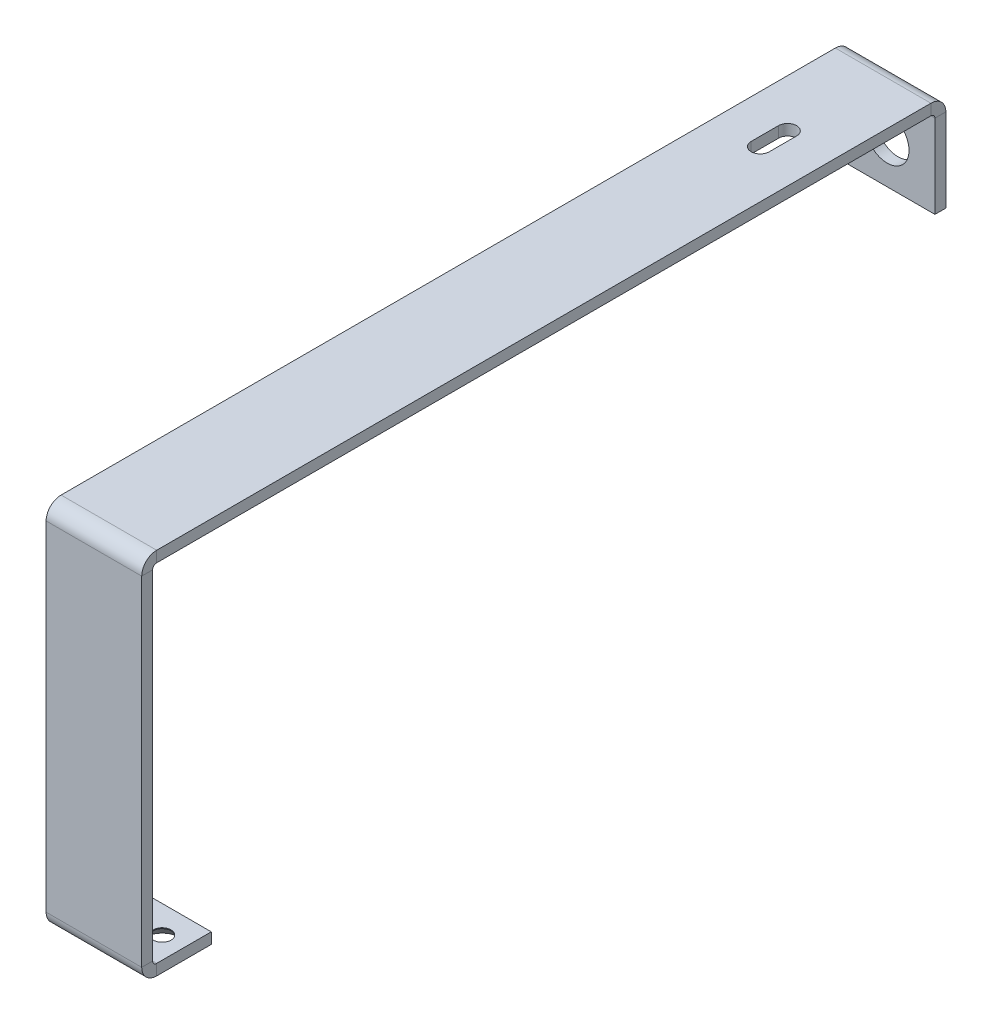
ISO-10303-21;
HEADER;
FILE_DESCRIPTION(('STEP AP214'),'2;1');
FILE_NAME('part.step','',(''),(''),'','','');
FILE_SCHEMA(('AUTOMOTIVE_DESIGN { 1 0 10303 214 1 1 1 1 }'));
ENDSEC;
DATA;
#1=APPLICATION_CONTEXT('core data for automotive mechanical design processes');
#2=APPLICATION_PROTOCOL_DEFINITION('international standard','automotive_design',2000,#1);
#3=PRODUCT_CONTEXT('',#1,'mechanical');
#4=PRODUCT('Part','Part','',(#3));
#5=PRODUCT_RELATED_PRODUCT_CATEGORY('part','',(#4));
#6=PRODUCT_DEFINITION_FORMATION('','',#4);
#7=PRODUCT_DEFINITION_CONTEXT('part definition',#1,'design');
#8=PRODUCT_DEFINITION('design','',#6,#7);
#9=PRODUCT_DEFINITION_SHAPE('','',#8);
#10=(LENGTH_UNIT() NAMED_UNIT(*) SI_UNIT(.MILLI.,.METRE.));
#11=(NAMED_UNIT(*) PLANE_ANGLE_UNIT() SI_UNIT($,.RADIAN.));
#12=(NAMED_UNIT(*) SI_UNIT($,.STERADIAN.) SOLID_ANGLE_UNIT());
#13=UNCERTAINTY_MEASURE_WITH_UNIT(LENGTH_MEASURE(1.E-05),#10,'distance_accuracy_value','');
#14=(GEOMETRIC_REPRESENTATION_CONTEXT(3) GLOBAL_UNCERTAINTY_ASSIGNED_CONTEXT((#13)) GLOBAL_UNIT_ASSIGNED_CONTEXT((#10,
#11,#12)) REPRESENTATION_CONTEXT('',''));
#15=CARTESIAN_POINT('',(0.,0.,0.));
#16=DIRECTION('',(0.,0.,1.));
#17=DIRECTION('',(1.,0.,0.));
#18=AXIS2_PLACEMENT_3D('',#15,#16,#17);
#19=CARTESIAN_POINT('',(0.,2.,0.));
#20=DIRECTION('',(0.,1.,0.));
#21=DIRECTION('',(0.,0.,1.));
#22=AXIS2_PLACEMENT_3D('',#19,#20,#21);
#23=PLANE('',#22);
#24=CARTESIAN_POINT('',(-4.75,2.,0.));
#25=DIRECTION('',(0.,1.,0.));
#26=DIRECTION('',(0.,0.,1.));
#27=AXIS2_PLACEMENT_3D('',#24,#25,#26);
#28=CIRCLE('',#27,1.63195);
#29=CARTESIAN_POINT('',(-4.75,2.,1.63195));
#30=VERTEX_POINT('',#29);
#31=EDGE_CURVE('E276',#30,#30,#28,.F.);
#32=ORIENTED_EDGE('',*,*,#31,.T.);
#33=EDGE_LOOP('',(#32));
#34=FACE_BOUND('',#33,.T.);
#35=DIRECTION('',(0.,0.,-1.));
#36=VECTOR('',#35,1.);
#37=CARTESIAN_POINT('',(8.75,2.,-5.));
#38=LINE('',#37,#36);
#39=CARTESIAN_POINT('',(8.75,2.,5.));
#40=VERTEX_POINT('',#39);
#41=CARTESIAN_POINT('',(8.75,2.,-5.));
#42=VERTEX_POINT('',#41);
#43=EDGE_CURVE('E424',#40,#42,#38,.T.);
#44=ORIENTED_EDGE('',*,*,#43,.T.);
#45=DIRECTION('',(-1.,0.,0.));
#46=VECTOR('',#45,1.);
#47=CARTESIAN_POINT('',(-8.75,2.,-5.));
#48=LINE('',#47,#46);
#49=CARTESIAN_POINT('',(-8.75,2.,-5.));
#50=VERTEX_POINT('',#49);
#51=EDGE_CURVE('E427',#42,#50,#48,.T.);
#52=ORIENTED_EDGE('',*,*,#51,.T.);
#53=DIRECTION('',(0.,0.,1.));
#54=VECTOR('',#53,1.);
#55=CARTESIAN_POINT('',(-8.75,2.,-5.));
#56=LINE('',#55,#54);
#57=CARTESIAN_POINT('',(-8.75,2.,5.));
#58=VERTEX_POINT('',#57);
#59=EDGE_CURVE('E430',#50,#58,#56,.T.);
#60=ORIENTED_EDGE('',*,*,#59,.T.);
#61=DIRECTION('',(1.,0.,0.));
#62=VECTOR('',#61,1.);
#63=CARTESIAN_POINT('',(-8.75,2.,5.));
#64=LINE('',#63,#62);
#65=EDGE_CURVE('E432',#58,#40,#64,.T.);
#66=ORIENTED_EDGE('',*,*,#65,.T.);
#67=EDGE_LOOP('',(#44,#52,#60,#66));
#68=FACE_BOUND('',#67,.T.);
#69=CARTESIAN_POINT('',(4.75,2.,0.));
#70=DIRECTION('',(0.,1.,0.));
#71=DIRECTION('',(0.,0.,1.));
#72=AXIS2_PLACEMENT_3D('',#69,#70,#71);
#73=CIRCLE('',#72,1.63195);
#74=CARTESIAN_POINT('',(4.75,2.,1.63195));
#75=VERTEX_POINT('',#74);
#76=EDGE_CURVE('E285',#75,#75,#73,.F.);
#77=ORIENTED_EDGE('',*,*,#76,.T.);
#78=EDGE_LOOP('',(#77));
#79=FACE_BOUND('',#78,.T.);
#80=ADVANCED_FACE('F103',(#34,#68,#79),#23,.T.);
#81=CARTESIAN_POINT('',(8.74999999999997,67.5000000000005,-139.48688749));
#82=DIRECTION('',(-1.,0.,0.));
#83=DIRECTION('',(0.,0.,1.));
#84=AXIS2_PLACEMENT_3D('',#81,#82,#83);
#85=PLANE('',#84);
#86=DIRECTION('',(0.,1.,0.));
#87=VECTOR('',#86,1.);
#88=CARTESIAN_POINT('',(8.74999999999999,65.5000000000005,-136.75028749));
#89=LINE('',#88,#87);
#90=CARTESIAN_POINT('',(8.74999999999997,65.5000000000005,-136.75028749));
#91=VERTEX_POINT('',#90);
#92=CARTESIAN_POINT('',(8.74999999999999,67.5000000000005,-136.75028749));
#93=VERTEX_POINT('',#92);
#94=EDGE_CURVE('E332',#91,#93,#89,.T.);
#95=ORIENTED_EDGE('',*,*,#94,.T.);
#96=DIRECTION('',(0.,0.,-1.));
#97=VECTOR('',#96,1.);
#98=CARTESIAN_POINT('',(8.74999999999999,67.5,2.4449831581799E-13));
#99=LINE('',#98,#97);
#100=CARTESIAN_POINT('',(8.74999999999998,67.5,5.));
#101=VERTEX_POINT('',#100);
#102=EDGE_CURVE('E352',#101,#93,#99,.T.);
#103=ORIENTED_EDGE('',*,*,#102,.F.);
#104=DIRECTION('',(0.,-1.,0.));
#105=VECTOR('',#104,1.);
#106=CARTESIAN_POINT('',(8.74999999999998,65.5,4.99999999999999));
#107=LINE('',#106,#105);
#108=CARTESIAN_POINT('',(8.74999999999998,65.5,4.99999999999999));
#109=VERTEX_POINT('',#108);
#110=EDGE_CURVE('E362',#109,#101,#107,.F.);
#111=ORIENTED_EDGE('',*,*,#110,.F.);
#112=DIRECTION('',(0.,0.,1.));
#113=VECTOR('',#112,1.);
#114=CARTESIAN_POINT('',(8.74999999999997,65.5000000000005,-139.48688749));
#115=LINE('',#114,#113);
#116=EDGE_CURVE('E356',#109,#91,#115,.F.);
#117=ORIENTED_EDGE('',*,*,#116,.T.);
#118=EDGE_LOOP('',(#95,#103,#111,#117));
#119=FACE_BOUND('',#118,.T.);
#120=ADVANCED_FACE('F491',(#119),#85,.F.);
#121=CARTESIAN_POINT('',(-8.75000000000002,67.5,5.7366));
#122=DIRECTION('',(1.,0.,0.));
#123=DIRECTION('',(0.,0.,-1.));
#124=AXIS2_PLACEMENT_3D('',#121,#122,#123);
#125=PLANE('',#124);
#126=DIRECTION('',(0.,1.,0.));
#127=VECTOR('',#126,1.);
#128=CARTESIAN_POINT('',(-8.75,65.5000000000005,-136.75028749));
#129=LINE('',#128,#127);
#130=CARTESIAN_POINT('',(-8.75,65.5000000000005,-136.75028749));
#131=VERTEX_POINT('',#130);
#132=CARTESIAN_POINT('',(-8.75,67.5000000000005,-136.75028749));
#133=VERTEX_POINT('',#132);
#134=EDGE_CURVE('E343',#131,#133,#129,.T.);
#135=ORIENTED_EDGE('',*,*,#134,.F.);
#136=DIRECTION('',(0.,0.,-1.));
#137=VECTOR('',#136,1.);
#138=CARTESIAN_POINT('',(-8.75000000000002,65.5,5.7366));
#139=LINE('',#138,#137);
#140=CARTESIAN_POINT('',(-8.75000000000002,65.5,4.99999999999999));
#141=VERTEX_POINT('',#140);
#142=EDGE_CURVE('E354',#131,#141,#139,.F.);
#143=ORIENTED_EDGE('',*,*,#142,.T.);
#144=DIRECTION('',(0.,-1.,0.));
#145=VECTOR('',#144,1.);
#146=CARTESIAN_POINT('',(-8.75000000000002,67.5,5.));
#147=LINE('',#146,#145);
#148=CARTESIAN_POINT('',(-8.75000000000002,67.5,5.));
#149=VERTEX_POINT('',#148);
#150=EDGE_CURVE('E346',#141,#149,#147,.F.);
#151=ORIENTED_EDGE('',*,*,#150,.T.);
#152=DIRECTION('',(0.,0.,1.));
#153=VECTOR('',#152,1.);
#154=CARTESIAN_POINT('',(-8.75000000000002,67.5,2.45648041233958E-13));
#155=LINE('',#154,#153);
#156=EDGE_CURVE('E349',#133,#149,#155,.T.);
#157=ORIENTED_EDGE('',*,*,#156,.F.);
#158=EDGE_LOOP('',(#135,#143,#151,#157));
#159=FACE_BOUND('',#158,.T.);
#160=ADVANCED_FACE('F546',(#159),#125,.F.);
#161=CARTESIAN_POINT('',(0.,67.5,2.45648041233958E-13));
#162=DIRECTION('',(0.,-1.,0.));
#163=DIRECTION('',(0.,0.,-1.));
#164=AXIS2_PLACEMENT_3D('',#161,#162,#163);
#165=PLANE('',#164);
#166=DIRECTION('',(0.,0.,1.));
#167=VECTOR('',#166,1.);
#168=CARTESIAN_POINT('',(-1.65,67.5000000000004,-119.25028749));
#169=LINE('',#168,#167);
#170=CARTESIAN_POINT('',(-1.65,67.5000000000004,-119.25028749));
#171=VERTEX_POINT('',#170);
#172=CARTESIAN_POINT('',(-1.65,67.5000000000004,-114.25028749));
#173=VERTEX_POINT('',#172);
#174=EDGE_CURVE('E842',#171,#173,#169,.T.);
#175=ORIENTED_EDGE('',*,*,#174,.F.);
#176=CARTESIAN_POINT('',(0.,67.5000000000004,-119.25028749));
#177=DIRECTION('',(0.,-1.,0.));
#178=DIRECTION('',(0.,0.,-1.));
#179=AXIS2_PLACEMENT_3D('',#176,#177,#178);
#180=CIRCLE('',#179,1.65);
#181=CARTESIAN_POINT('',(1.65,67.5000000000004,-119.25028749));
#182=VERTEX_POINT('',#181);
#183=EDGE_CURVE('E271',#182,#171,#180,.F.);
#184=ORIENTED_EDGE('',*,*,#183,.F.);
#185=DIRECTION('',(0.,0.,-1.));
#186=VECTOR('',#185,1.);
#187=CARTESIAN_POINT('',(1.65,67.5000000000004,-119.25028749));
#188=LINE('',#187,#186);
#189=CARTESIAN_POINT('',(1.65,67.5000000000004,-114.25028749));
#190=VERTEX_POINT('',#189);
#191=EDGE_CURVE('E268',#190,#182,#188,.T.);
#192=ORIENTED_EDGE('',*,*,#191,.F.);
#193=CARTESIAN_POINT('',(0.,67.5000000000004,-114.25028749));
#194=DIRECTION('',(0.,-1.,0.));
#195=DIRECTION('',(0.,0.,-1.));
#196=AXIS2_PLACEMENT_3D('',#193,#194,#195);
#197=CIRCLE('',#196,1.65);
#198=EDGE_CURVE('E246',#173,#190,#197,.F.);
#199=ORIENTED_EDGE('',*,*,#198,.F.);
#200=EDGE_LOOP('',(#175,#184,#192,#199));
#201=FACE_BOUND('',#200,.T.);
#202=DIRECTION('',(1.,0.,0.));
#203=VECTOR('',#202,1.);
#204=CARTESIAN_POINT('',(8.75,67.5000000000005,-136.75028749));
#205=LINE('',#204,#203);
#206=EDGE_CURVE('E326',#93,#133,#205,.F.);
#207=ORIENTED_EDGE('',*,*,#206,.T.);
#208=ORIENTED_EDGE('',*,*,#156,.T.);
#209=DIRECTION('',(1.,0.,0.));
#210=VECTOR('',#209,1.);
#211=CARTESIAN_POINT('',(-8.75000000000002,67.5,5.));
#212=LINE('',#211,#210);
#213=EDGE_CURVE('E359',#101,#149,#212,.F.);
#214=ORIENTED_EDGE('',*,*,#213,.F.);
#215=ORIENTED_EDGE('',*,*,#102,.T.);
#216=EDGE_LOOP('',(#207,#208,#214,#215));
#217=FACE_BOUND('',#216,.T.);
#218=ADVANCED_FACE('F489',(#201,#217),#165,.F.);
#219=CARTESIAN_POINT('',(0.,65.5,2.38665078556272E-13));
#220=DIRECTION('',(0.,-1.,0.));
#221=DIRECTION('',(0.,0.,-1.));
#222=AXIS2_PLACEMENT_3D('',#219,#220,#221);
#223=PLANE('',#222);
#224=CARTESIAN_POINT('',(0.,65.5000000000004,-119.25028749));
#225=DIRECTION('',(0.,-1.,0.));
#226=DIRECTION('',(0.,0.,-1.));
#227=AXIS2_PLACEMENT_3D('',#224,#225,#226);
#228=CIRCLE('',#227,1.65);
#229=CARTESIAN_POINT('',(-1.65,65.5000000000004,-119.25028749));
#230=VERTEX_POINT('',#229);
#231=CARTESIAN_POINT('',(1.65,65.5000000000004,-119.25028749));
#232=VERTEX_POINT('',#231);
#233=EDGE_CURVE('E126',#230,#232,#228,.T.);
#234=ORIENTED_EDGE('',*,*,#233,.F.);
#235=DIRECTION('',(0.,0.,-1.));
#236=VECTOR('',#235,1.);
#237=CARTESIAN_POINT('',(-1.65,65.5000000000004,-119.25028749));
#238=LINE('',#237,#236);
#239=CARTESIAN_POINT('',(-1.65,65.5000000000004,-114.25028749));
#240=VERTEX_POINT('',#239);
#241=EDGE_CURVE('E259',#240,#230,#238,.T.);
#242=ORIENTED_EDGE('',*,*,#241,.F.);
#243=CARTESIAN_POINT('',(0.,65.5000000000004,-114.25028749));
#244=DIRECTION('',(0.,-1.,0.));
#245=DIRECTION('',(0.,0.,-1.));
#246=AXIS2_PLACEMENT_3D('',#243,#244,#245);
#247=CIRCLE('',#246,1.65);
#248=CARTESIAN_POINT('',(1.65,65.5000000000004,-114.25028749));
#249=VERTEX_POINT('',#248);
#250=EDGE_CURVE('E243',#249,#240,#247,.T.);
#251=ORIENTED_EDGE('',*,*,#250,.F.);
#252=DIRECTION('',(0.,0.,1.));
#253=VECTOR('',#252,1.);
#254=CARTESIAN_POINT('',(1.65,65.5000000000004,-119.25028749));
#255=LINE('',#254,#253);
#256=EDGE_CURVE('E252',#232,#249,#255,.T.);
#257=ORIENTED_EDGE('',*,*,#256,.F.);
#258=EDGE_LOOP('',(#234,#242,#251,#257));
#259=FACE_BOUND('',#258,.T.);
#260=ORIENTED_EDGE('',*,*,#142,.F.);
#261=DIRECTION('',(1.,0.,0.));
#262=VECTOR('',#261,1.);
#263=CARTESIAN_POINT('',(8.75,65.5000000000005,-136.75028749));
#264=LINE('',#263,#262);
#265=EDGE_CURVE('E338',#91,#131,#264,.F.);
#266=ORIENTED_EDGE('',*,*,#265,.F.);
#267=ORIENTED_EDGE('',*,*,#116,.F.);
#268=DIRECTION('',(1.,0.,0.));
#269=VECTOR('',#268,1.);
#270=CARTESIAN_POINT('',(-8.75000000000002,65.5,4.99999999999999));
#271=LINE('',#270,#269);
#272=EDGE_CURVE('E365',#141,#109,#271,.T.);
#273=ORIENTED_EDGE('',*,*,#272,.F.);
#274=EDGE_LOOP('',(#260,#266,#267,#273));
#275=FACE_BOUND('',#274,.T.);
#276=ADVANCED_FACE('F256',(#259,#275),#223,.T.);
#277=CARTESIAN_POINT('',(8.74999999999999,67.5,7.7366));
#278=DIRECTION('',(-1.,0.,0.));
#279=DIRECTION('',(0.,-1.,0.));
#280=AXIS2_PLACEMENT_3D('',#277,#278,#279);
#281=PLANE('',#280);
#282=DIRECTION('',(0.,0.,1.));
#283=VECTOR('',#282,1.);
#284=CARTESIAN_POINT('',(8.74999999999998,64.7634,5.73659999999999));
#285=LINE('',#284,#283);
#286=CARTESIAN_POINT('',(8.74999999999999,64.7634,5.7366));
#287=VERTEX_POINT('',#286);
#288=CARTESIAN_POINT('',(8.74999999999998,64.7634,7.73659999999999));
#289=VERTEX_POINT('',#288);
#290=EDGE_CURVE('E375',#287,#289,#285,.T.);
#291=ORIENTED_EDGE('',*,*,#290,.T.);
#292=DIRECTION('',(0.,1.,0.));
#293=VECTOR('',#292,1.);
#294=CARTESIAN_POINT('',(8.74999999999999,0.,7.7366));
#295=LINE('',#294,#293);
#296=CARTESIAN_POINT('',(8.74999999999999,2.7366,7.7366));
#297=VERTEX_POINT('',#296);
#298=EDGE_CURVE('E395',#297,#289,#295,.T.);
#299=ORIENTED_EDGE('',*,*,#298,.F.);
#300=DIRECTION('',(0.,0.,-1.));
#301=VECTOR('',#300,1.);
#302=CARTESIAN_POINT('',(8.74999999999999,2.7366,5.7366));
#303=LINE('',#302,#301);
#304=CARTESIAN_POINT('',(8.74999999999999,2.7366,5.7366));
#305=VERTEX_POINT('',#304);
#306=EDGE_CURVE('E405',#305,#297,#303,.F.);
#307=ORIENTED_EDGE('',*,*,#306,.F.);
#308=DIRECTION('',(0.,-1.,0.));
#309=VECTOR('',#308,1.);
#310=CARTESIAN_POINT('',(8.74999999999999,67.5,5.7366));
#311=LINE('',#310,#309);
#312=EDGE_CURVE('E399',#305,#287,#311,.F.);
#313=ORIENTED_EDGE('',*,*,#312,.T.);
#314=EDGE_LOOP('',(#291,#299,#307,#313));
#315=FACE_BOUND('',#314,.T.);
#316=ADVANCED_FACE('F473',(#315),#281,.F.);
#317=CARTESIAN_POINT('',(-8.74999999999999,2.,7.7366));
#318=DIRECTION('',(1.,0.,0.));
#319=DIRECTION('',(0.,1.,0.));
#320=AXIS2_PLACEMENT_3D('',#317,#318,#319);
#321=PLANE('',#320);
#322=DIRECTION('',(0.,0.,1.));
#323=VECTOR('',#322,1.);
#324=CARTESIAN_POINT('',(-8.75000000000002,64.7634,5.73659999999999));
#325=LINE('',#324,#323);
#326=CARTESIAN_POINT('',(-8.75000000000002,64.7634,5.73659999999999));
#327=VERTEX_POINT('',#326);
#328=CARTESIAN_POINT('',(-8.75000000000002,64.7634,7.7366));
#329=VERTEX_POINT('',#328);
#330=EDGE_CURVE('E386',#327,#329,#325,.T.);
#331=ORIENTED_EDGE('',*,*,#330,.F.);
#332=DIRECTION('',(0.,1.,0.));
#333=VECTOR('',#332,1.);
#334=CARTESIAN_POINT('',(-8.74999999999999,2.,5.7366));
#335=LINE('',#334,#333);
#336=CARTESIAN_POINT('',(-8.74999999999998,2.7366,5.7366));
#337=VERTEX_POINT('',#336);
#338=EDGE_CURVE('E397',#327,#337,#335,.F.);
#339=ORIENTED_EDGE('',*,*,#338,.T.);
#340=DIRECTION('',(0.,0.,-1.));
#341=VECTOR('',#340,1.);
#342=CARTESIAN_POINT('',(-8.74999999999999,2.7366,7.7366));
#343=LINE('',#342,#341);
#344=CARTESIAN_POINT('',(-8.74999999999998,2.7366,7.7366));
#345=VERTEX_POINT('',#344);
#346=EDGE_CURVE('E389',#337,#345,#343,.F.);
#347=ORIENTED_EDGE('',*,*,#346,.T.);
#348=DIRECTION('',(0.,-1.,0.));
#349=VECTOR('',#348,1.);
#350=CARTESIAN_POINT('',(-8.74999999999999,0.,7.7366));
#351=LINE('',#350,#349);
#352=EDGE_CURVE('E392',#329,#345,#351,.T.);
#353=ORIENTED_EDGE('',*,*,#352,.F.);
#354=EDGE_LOOP('',(#331,#339,#347,#353));
#355=FACE_BOUND('',#354,.T.);
#356=ADVANCED_FACE('F589',(#355),#321,.F.);
#357=CARTESIAN_POINT('',(0.,0.,7.7366));
#358=DIRECTION('',(0.,0.,-1.));
#359=DIRECTION('',(-1.,0.,0.));
#360=AXIS2_PLACEMENT_3D('',#357,#358,#359);
#361=PLANE('',#360);
#362=DIRECTION('',(1.,0.,0.));
#363=VECTOR('',#362,1.);
#364=CARTESIAN_POINT('',(8.74999999999999,64.7634,7.73659999999999));
#365=LINE('',#364,#363);
#366=EDGE_CURVE('E369',#289,#329,#365,.F.);
#367=ORIENTED_EDGE('',*,*,#366,.T.);
#368=ORIENTED_EDGE('',*,*,#352,.T.);
#369=DIRECTION('',(1.,0.,0.));
#370=VECTOR('',#369,1.);
#371=CARTESIAN_POINT('',(-8.75,2.7366,7.7366));
#372=LINE('',#371,#370);
#373=EDGE_CURVE('E402',#297,#345,#372,.F.);
#374=ORIENTED_EDGE('',*,*,#373,.F.);
#375=ORIENTED_EDGE('',*,*,#298,.T.);
#376=EDGE_LOOP('',(#367,#368,#374,#375));
#377=FACE_BOUND('',#376,.T.);
#378=ADVANCED_FACE('F469',(#377),#361,.F.);
#379=CARTESIAN_POINT('',(0.,0.,5.7366));
#380=DIRECTION('',(0.,0.,-1.));
#381=DIRECTION('',(-1.,0.,0.));
#382=AXIS2_PLACEMENT_3D('',#379,#380,#381);
#383=PLANE('',#382);
#384=ORIENTED_EDGE('',*,*,#338,.F.);
#385=DIRECTION('',(1.,0.,0.));
#386=VECTOR('',#385,1.);
#387=CARTESIAN_POINT('',(8.74999999999999,64.7634,5.73659999999999));
#388=LINE('',#387,#386);
#389=EDGE_CURVE('E381',#287,#327,#388,.F.);
#390=ORIENTED_EDGE('',*,*,#389,.F.);
#391=ORIENTED_EDGE('',*,*,#312,.F.);
#392=DIRECTION('',(1.,0.,0.));
#393=VECTOR('',#392,1.);
#394=CARTESIAN_POINT('',(-8.75,2.7366,5.7366));
#395=LINE('',#394,#393);
#396=EDGE_CURVE('E408',#337,#305,#395,.T.);
#397=ORIENTED_EDGE('',*,*,#396,.F.);
#398=EDGE_LOOP('',(#384,#390,#391,#397));
#399=FACE_BOUND('',#398,.T.);
#400=ADVANCED_FACE('F561',(#399),#383,.T.);
#401=CARTESIAN_POINT('',(8.75,2.,-5.));
#402=DIRECTION('',(-1.,0.,0.));
#403=DIRECTION('',(0.,0.,1.));
#404=AXIS2_PLACEMENT_3D('',#401,#402,#403);
#405=PLANE('',#404);
#406=DIRECTION('',(0.,0.,-1.));
#407=VECTOR('',#406,1.);
#408=CARTESIAN_POINT('',(8.75,0.,-5.));
#409=LINE('',#408,#407);
#410=CARTESIAN_POINT('',(8.74999999999999,0.,5.));
#411=VERTEX_POINT('',#410);
#412=CARTESIAN_POINT('',(8.75,0.,-5.));
#413=VERTEX_POINT('',#412);
#414=EDGE_CURVE('E415',#411,#413,#409,.T.);
#415=ORIENTED_EDGE('',*,*,#414,.T.);
#416=DIRECTION('',(0.,-1.,0.));
#417=VECTOR('',#416,1.);
#418=CARTESIAN_POINT('',(8.75,2.,-5.));
#419=LINE('',#418,#417);
#420=EDGE_CURVE('E13',#42,#413,#419,.T.);
#421=ORIENTED_EDGE('',*,*,#420,.F.);
#422=ORIENTED_EDGE('',*,*,#43,.F.);
#423=DIRECTION('',(0.,-1.,0.));
#424=VECTOR('',#423,1.);
#425=CARTESIAN_POINT('',(8.75,2.,5.));
#426=LINE('',#425,#424);
#427=EDGE_CURVE('E434',#40,#411,#426,.T.);
#428=ORIENTED_EDGE('',*,*,#427,.T.);
#429=EDGE_LOOP('',(#415,#421,#422,#428));
#430=FACE_BOUND('',#429,.T.);
#431=ADVANCED_FACE('F105',(#430),#405,.F.);
#432=CARTESIAN_POINT('',(-8.75,2.,-5.));
#433=DIRECTION('',(0.,0.,1.));
#434=DIRECTION('',(1.,0.,0.));
#435=AXIS2_PLACEMENT_3D('',#432,#433,#434);
#436=PLANE('',#435);
#437=DIRECTION('',(-1.,0.,0.));
#438=VECTOR('',#437,1.);
#439=CARTESIAN_POINT('',(-8.75,0.,-5.));
#440=LINE('',#439,#438);
#441=CARTESIAN_POINT('',(-8.75,0.,-5.));
#442=VERTEX_POINT('',#441);
#443=EDGE_CURVE('E437',#413,#442,#440,.T.);
#444=ORIENTED_EDGE('',*,*,#443,.T.);
#445=DIRECTION('',(0.,-1.,0.));
#446=VECTOR('',#445,1.);
#447=CARTESIAN_POINT('',(-8.75,2.,-5.));
#448=LINE('',#447,#446);
#449=EDGE_CURVE('E111',#50,#442,#448,.T.);
#450=ORIENTED_EDGE('',*,*,#449,.F.);
#451=ORIENTED_EDGE('',*,*,#51,.F.);
#452=ORIENTED_EDGE('',*,*,#420,.T.);
#453=EDGE_LOOP('',(#444,#450,#451,#452));
#454=FACE_BOUND('',#453,.T.);
#455=ADVANCED_FACE('F556',(#454),#436,.F.);
#456=CARTESIAN_POINT('',(-8.75,2.,-5.));
#457=DIRECTION('',(1.,0.,0.));
#458=DIRECTION('',(0.,0.,-1.));
#459=AXIS2_PLACEMENT_3D('',#456,#457,#458);
#460=PLANE('',#459);
#461=DIRECTION('',(0.,0.,1.));
#462=VECTOR('',#461,1.);
#463=CARTESIAN_POINT('',(-8.75,0.,-5.));
#464=LINE('',#463,#462);
#465=CARTESIAN_POINT('',(-8.75,0.,5.));
#466=VERTEX_POINT('',#465);
#467=EDGE_CURVE('E439',#442,#466,#464,.T.);
#468=ORIENTED_EDGE('',*,*,#467,.T.);
#469=DIRECTION('',(0.,-1.,0.));
#470=VECTOR('',#469,1.);
#471=CARTESIAN_POINT('',(-8.75,2.,5.));
#472=LINE('',#471,#470);
#473=EDGE_CURVE('E445',#58,#466,#472,.T.);
#474=ORIENTED_EDGE('',*,*,#473,.F.);
#475=ORIENTED_EDGE('',*,*,#59,.F.);
#476=ORIENTED_EDGE('',*,*,#449,.T.);
#477=EDGE_LOOP('',(#468,#474,#475,#476));
#478=FACE_BOUND('',#477,.T.);
#479=ADVANCED_FACE('F452',(#478),#460,.F.);
#480=CARTESIAN_POINT('',(0.,0.,0.));
#481=DIRECTION('',(0.,1.,0.));
#482=DIRECTION('',(0.,0.,1.));
#483=AXIS2_PLACEMENT_3D('',#480,#481,#482);
#484=PLANE('',#483);
#485=CARTESIAN_POINT('',(-4.75,0.,0.));
#486=DIRECTION('',(0.,-1.,0.));
#487=DIRECTION('',(0.,0.,-1.));
#488=AXIS2_PLACEMENT_3D('',#485,#486,#487);
#489=CIRCLE('',#488,3.2385);
#490=CARTESIAN_POINT('',(-4.75,0.,-3.2385));
#491=VERTEX_POINT('',#490);
#492=EDGE_CURVE('E270',#491,#491,#489,.T.);
#493=ORIENTED_EDGE('',*,*,#492,.F.);
#494=EDGE_LOOP('',(#493));
#495=FACE_BOUND('',#494,.T.);
#496=CARTESIAN_POINT('',(4.75,0.,0.));
#497=DIRECTION('',(0.,-1.,0.));
#498=DIRECTION('',(0.,0.,-1.));
#499=AXIS2_PLACEMENT_3D('',#496,#497,#498);
#500=CIRCLE('',#499,3.2385);
#501=CARTESIAN_POINT('',(4.75,0.,-3.2385));
#502=VERTEX_POINT('',#501);
#503=EDGE_CURVE('E275',#502,#502,#500,.T.);
#504=ORIENTED_EDGE('',*,*,#503,.F.);
#505=EDGE_LOOP('',(#504));
#506=FACE_BOUND('',#505,.T.);
#507=ORIENTED_EDGE('',*,*,#414,.F.);
#508=DIRECTION('',(1.,0.,0.));
#509=VECTOR('',#508,1.);
#510=CARTESIAN_POINT('',(-8.75,0.,5.));
#511=LINE('',#510,#509);
#512=EDGE_CURVE('E428',#466,#411,#511,.T.);
#513=ORIENTED_EDGE('',*,*,#512,.F.);
#514=ORIENTED_EDGE('',*,*,#467,.F.);
#515=ORIENTED_EDGE('',*,*,#443,.F.);
#516=EDGE_LOOP('',(#507,#513,#514,#515));
#517=FACE_BOUND('',#516,.T.);
#518=ADVANCED_FACE('F457',(#495,#506,#517),#484,.F.);
#519=CARTESIAN_POINT('',(-8.74999999999999,2.7366,5.));
#520=DIRECTION('',(-1.,0.,0.));
#521=DIRECTION('',(0.,0.,1.));
#522=AXIS2_PLACEMENT_3D('',#519,#520,#521);
#523=PLANE('',#522);
#524=ORIENTED_EDGE('',*,*,#346,.F.);
#525=CARTESIAN_POINT('',(-8.74999999999999,2.7366,5.));
#526=DIRECTION('',(1.,0.,0.));
#527=DIRECTION('',(0.,0.,-1.));
#528=AXIS2_PLACEMENT_3D('',#525,#526,#527);
#529=CIRCLE('',#528,0.736599999999998);
#530=EDGE_CURVE('E419',#58,#337,#529,.F.);
#531=ORIENTED_EDGE('',*,*,#530,.F.);
#532=ORIENTED_EDGE('',*,*,#473,.T.);
#533=CARTESIAN_POINT('',(-8.74999999999998,2.7366,5.));
#534=DIRECTION('',(1.,0.,0.));
#535=DIRECTION('',(0.,0.,-1.));
#536=AXIS2_PLACEMENT_3D('',#533,#534,#535);
#537=CIRCLE('',#536,2.7366);
#538=EDGE_CURVE('E412',#466,#345,#537,.F.);
#539=ORIENTED_EDGE('',*,*,#538,.T.);
#540=EDGE_LOOP('',(#524,#531,#532,#539));
#541=FACE_BOUND('',#540,.T.);
#542=ADVANCED_FACE('F463',(#541),#523,.T.);
#543=CARTESIAN_POINT('',(8.74999999999999,2.7366,5.));
#544=DIRECTION('',(-1.,0.,0.));
#545=DIRECTION('',(0.,0.,1.));
#546=AXIS2_PLACEMENT_3D('',#543,#544,#545);
#547=PLANE('',#546);
#548=CARTESIAN_POINT('',(8.74999999999999,2.7366,5.));
#549=DIRECTION('',(1.,0.,0.));
#550=DIRECTION('',(0.,0.,-1.));
#551=AXIS2_PLACEMENT_3D('',#548,#549,#550);
#552=CIRCLE('',#551,0.736599999999998);
#553=EDGE_CURVE('E394',#305,#40,#552,.T.);
#554=ORIENTED_EDGE('',*,*,#553,.F.);
#555=ORIENTED_EDGE('',*,*,#306,.T.);
#556=CARTESIAN_POINT('',(8.74999999999999,2.7366,5.));
#557=DIRECTION('',(1.,0.,0.));
#558=DIRECTION('',(0.,0.,-1.));
#559=AXIS2_PLACEMENT_3D('',#556,#557,#558);
#560=CIRCLE('',#559,2.7366);
#561=EDGE_CURVE('E416',#297,#411,#560,.T.);
#562=ORIENTED_EDGE('',*,*,#561,.T.);
#563=ORIENTED_EDGE('',*,*,#427,.F.);
#564=EDGE_LOOP('',(#554,#555,#562,#563));
#565=FACE_BOUND('',#564,.T.);
#566=ADVANCED_FACE('F551',(#565),#547,.F.);
#567=CARTESIAN_POINT('',(8.74999999999999,2.7366,5.));
#568=DIRECTION('',(1.,0.,0.));
#569=DIRECTION('',(0.,0.,1.));
#570=AXIS2_PLACEMENT_3D('',#567,#568,#569);
#571=CYLINDRICAL_SURFACE('',#570,2.7366);
#572=ORIENTED_EDGE('',*,*,#512,.T.);
#573=ORIENTED_EDGE('',*,*,#561,.F.);
#574=ORIENTED_EDGE('',*,*,#373,.T.);
#575=ORIENTED_EDGE('',*,*,#538,.F.);
#576=EDGE_LOOP('',(#572,#573,#574,#575));
#577=FACE_BOUND('',#576,.T.);
#578=ADVANCED_FACE('F465',(#577),#571,.T.);
#579=CARTESIAN_POINT('',(8.74999999999999,2.7366,5.));
#580=DIRECTION('',(1.,0.,0.));
#581=DIRECTION('',(0.,0.,1.));
#582=AXIS2_PLACEMENT_3D('',#579,#580,#581);
#583=CYLINDRICAL_SURFACE('',#582,0.736599999999998);
#584=ORIENTED_EDGE('',*,*,#65,.F.);
#585=ORIENTED_EDGE('',*,*,#530,.T.);
#586=ORIENTED_EDGE('',*,*,#396,.T.);
#587=ORIENTED_EDGE('',*,*,#553,.T.);
#588=EDGE_LOOP('',(#584,#585,#586,#587));
#589=FACE_BOUND('',#588,.T.);
#590=ADVANCED_FACE('F569',(#589),#583,.F.);
#591=CARTESIAN_POINT('',(-8.75000000000002,64.7634,4.99999999999999));
#592=DIRECTION('',(-1.,0.,0.));
#593=DIRECTION('',(0.,0.,1.));
#594=AXIS2_PLACEMENT_3D('',#591,#592,#593);
#595=PLANE('',#594);
#596=ORIENTED_EDGE('',*,*,#150,.F.);
#597=CARTESIAN_POINT('',(-8.75000000000002,64.7634,4.99999999999999));
#598=DIRECTION('',(1.,0.,0.));
#599=DIRECTION('',(0.,0.,-1.));
#600=AXIS2_PLACEMENT_3D('',#597,#598,#599);
#601=CIRCLE('',#600,0.736600000000004);
#602=EDGE_CURVE('E378',#327,#141,#601,.F.);
#603=ORIENTED_EDGE('',*,*,#602,.F.);
#604=ORIENTED_EDGE('',*,*,#330,.T.);
#605=CARTESIAN_POINT('',(-8.75000000000002,64.7634,4.99999999999999));
#606=DIRECTION('',(1.,0.,0.));
#607=DIRECTION('',(0.,0.,-1.));
#608=AXIS2_PLACEMENT_3D('',#605,#606,#607);
#609=CIRCLE('',#608,2.7366);
#610=EDGE_CURVE('E371',#329,#149,#609,.F.);
#611=ORIENTED_EDGE('',*,*,#610,.T.);
#612=EDGE_LOOP('',(#596,#603,#604,#611));
#613=FACE_BOUND('',#612,.T.);
#614=ADVANCED_FACE('F579',(#613),#595,.T.);
#615=CARTESIAN_POINT('',(8.74999999999998,64.7634,4.99999999999999));
#616=DIRECTION('',(-1.,0.,0.));
#617=DIRECTION('',(0.,0.,1.));
#618=AXIS2_PLACEMENT_3D('',#615,#616,#617);
#619=PLANE('',#618);
#620=CARTESIAN_POINT('',(8.74999999999998,64.7634,4.99999999999999));
#621=DIRECTION('',(1.,0.,0.));
#622=DIRECTION('',(0.,0.,-1.));
#623=AXIS2_PLACEMENT_3D('',#620,#621,#622);
#624=CIRCLE('',#623,0.736600000000004);
#625=EDGE_CURVE('E351',#109,#287,#624,.T.);
#626=ORIENTED_EDGE('',*,*,#625,.F.);
#627=ORIENTED_EDGE('',*,*,#110,.T.);
#628=CARTESIAN_POINT('',(8.74999999999998,64.7634,4.99999999999999));
#629=DIRECTION('',(1.,0.,0.));
#630=DIRECTION('',(0.,0.,-1.));
#631=AXIS2_PLACEMENT_3D('',#628,#629,#630);
#632=CIRCLE('',#631,2.7366);
#633=EDGE_CURVE('E372',#101,#289,#632,.T.);
#634=ORIENTED_EDGE('',*,*,#633,.T.);
#635=ORIENTED_EDGE('',*,*,#290,.F.);
#636=EDGE_LOOP('',(#626,#627,#634,#635));
#637=FACE_BOUND('',#636,.T.);
#638=ADVANCED_FACE('F482',(#637),#619,.F.);
#639=CARTESIAN_POINT('',(8.74999999999999,64.7634,4.99999999999999));
#640=DIRECTION('',(1.,0.,0.));
#641=DIRECTION('',(0.,1.,0.));
#642=AXIS2_PLACEMENT_3D('',#639,#640,#641);
#643=CYLINDRICAL_SURFACE('',#642,2.7366);
#644=ORIENTED_EDGE('',*,*,#366,.F.);
#645=ORIENTED_EDGE('',*,*,#633,.F.);
#646=ORIENTED_EDGE('',*,*,#213,.T.);
#647=ORIENTED_EDGE('',*,*,#610,.F.);
#648=EDGE_LOOP('',(#644,#645,#646,#647));
#649=FACE_BOUND('',#648,.T.);
#650=ADVANCED_FACE('F481',(#649),#643,.T.);
#651=CARTESIAN_POINT('',(8.74999999999999,64.7634,4.99999999999999));
#652=DIRECTION('',(1.,0.,0.));
#653=DIRECTION('',(0.,1.,0.));
#654=AXIS2_PLACEMENT_3D('',#651,#652,#653);
#655=CYLINDRICAL_SURFACE('',#654,0.736600000000004);
#656=ORIENTED_EDGE('',*,*,#389,.T.);
#657=ORIENTED_EDGE('',*,*,#602,.T.);
#658=ORIENTED_EDGE('',*,*,#272,.T.);
#659=ORIENTED_EDGE('',*,*,#625,.T.);
#660=EDGE_LOOP('',(#656,#657,#658,#659));
#661=FACE_BOUND('',#660,.T.);
#662=ADVANCED_FACE('F575',(#661),#655,.F.);
#663=CARTESIAN_POINT('',(-8.75,64.7634000000005,-136.75028749));
#664=DIRECTION('',(-1.,0.,0.));
#665=DIRECTION('',(0.,0.,1.));
#666=AXIS2_PLACEMENT_3D('',#663,#664,#665);
#667=PLANE('',#666);
#668=DIRECTION('',(0.,0.,1.));
#669=VECTOR('',#668,1.);
#670=CARTESIAN_POINT('',(-8.75,64.7634000000005,-139.48688749));
#671=LINE('',#670,#669);
#672=CARTESIAN_POINT('',(-8.75,64.7634000000005,-137.48688749));
#673=VERTEX_POINT('',#672);
#674=CARTESIAN_POINT('',(-8.75,64.7634000000005,-139.48688749));
#675=VERTEX_POINT('',#674);
#676=EDGE_CURVE('E295',#673,#675,#671,.F.);
#677=ORIENTED_EDGE('',*,*,#676,.F.);
#678=CARTESIAN_POINT('',(-8.75,64.7634000000005,-136.75028749));
#679=DIRECTION('',(1.,0.,0.));
#680=DIRECTION('',(0.,0.,-1.));
#681=AXIS2_PLACEMENT_3D('',#678,#679,#680);
#682=CIRCLE('',#681,0.736600000000004);
#683=EDGE_CURVE('E335',#131,#673,#682,.F.);
#684=ORIENTED_EDGE('',*,*,#683,.F.);
#685=ORIENTED_EDGE('',*,*,#134,.T.);
#686=CARTESIAN_POINT('',(-8.75,64.7634000000005,-136.75028749));
#687=DIRECTION('',(1.,0.,0.));
#688=DIRECTION('',(0.,0.,-1.));
#689=AXIS2_PLACEMENT_3D('',#686,#687,#688);
#690=CIRCLE('',#689,2.7366);
#691=EDGE_CURVE('E328',#133,#675,#690,.F.);
#692=ORIENTED_EDGE('',*,*,#691,.T.);
#693=EDGE_LOOP('',(#677,#684,#685,#692));
#694=FACE_BOUND('',#693,.T.);
#695=ADVANCED_FACE('F520',(#694),#667,.T.);
#696=CARTESIAN_POINT('',(8.74999999999999,64.7634000000005,-136.75028749));
#697=DIRECTION('',(-1.,0.,0.));
#698=DIRECTION('',(0.,0.,1.));
#699=AXIS2_PLACEMENT_3D('',#696,#697,#698);
#700=PLANE('',#699);
#701=CARTESIAN_POINT('',(8.74999999999999,64.7634000000005,-136.75028749));
#702=DIRECTION('',(1.,0.,0.));
#703=DIRECTION('',(0.,0.,-1.));
#704=AXIS2_PLACEMENT_3D('',#701,#702,#703);
#705=CIRCLE('',#704,0.736600000000004);
#706=CARTESIAN_POINT('',(8.74999999999999,64.7634000000005,-137.48688749));
#707=VERTEX_POINT('',#706);
#708=EDGE_CURVE('E299',#707,#91,#705,.T.);
#709=ORIENTED_EDGE('',*,*,#708,.F.);
#710=DIRECTION('',(0.,0.,1.));
#711=VECTOR('',#710,1.);
#712=CARTESIAN_POINT('',(8.74999999999999,64.7634000000005,-137.48688749));
#713=LINE('',#712,#711);
#714=CARTESIAN_POINT('',(8.75,64.7634000000005,-139.48688749));
#715=VERTEX_POINT('',#714);
#716=EDGE_CURVE('E319',#707,#715,#713,.F.);
#717=ORIENTED_EDGE('',*,*,#716,.T.);
#718=CARTESIAN_POINT('',(8.74999999999999,64.7634000000005,-136.75028749));
#719=DIRECTION('',(1.,0.,0.));
#720=DIRECTION('',(0.,0.,-1.));
#721=AXIS2_PLACEMENT_3D('',#718,#719,#720);
#722=CIRCLE('',#721,2.7366);
#723=EDGE_CURVE('E329',#715,#93,#722,.T.);
#724=ORIENTED_EDGE('',*,*,#723,.T.);
#725=ORIENTED_EDGE('',*,*,#94,.F.);
#726=EDGE_LOOP('',(#709,#717,#724,#725));
#727=FACE_BOUND('',#726,.T.);
#728=ADVANCED_FACE('F499',(#727),#700,.F.);
#729=CARTESIAN_POINT('',(8.75,64.7634000000005,-136.75028749));
#730=DIRECTION('',(1.,0.,0.));
#731=DIRECTION('',(0.,0.,-1.));
#732=AXIS2_PLACEMENT_3D('',#729,#730,#731);
#733=CYLINDRICAL_SURFACE('',#732,2.7366);
#734=ORIENTED_EDGE('',*,*,#206,.F.);
#735=ORIENTED_EDGE('',*,*,#723,.F.);
#736=DIRECTION('',(1.,0.,0.));
#737=VECTOR('',#736,1.);
#738=CARTESIAN_POINT('',(-8.75,64.7634000000005,-139.48688749));
#739=LINE('',#738,#737);
#740=EDGE_CURVE('E317',#715,#675,#739,.F.);
#741=ORIENTED_EDGE('',*,*,#740,.T.);
#742=ORIENTED_EDGE('',*,*,#691,.F.);
#743=EDGE_LOOP('',(#734,#735,#741,#742));
#744=FACE_BOUND('',#743,.T.);
#745=ADVANCED_FACE('F498',(#744),#733,.T.);
#746=CARTESIAN_POINT('',(8.75,64.7634000000005,-136.75028749));
#747=DIRECTION('',(1.,0.,0.));
#748=DIRECTION('',(0.,0.,-1.));
#749=AXIS2_PLACEMENT_3D('',#746,#747,#748);
#750=CYLINDRICAL_SURFACE('',#749,0.736600000000004);
#751=ORIENTED_EDGE('',*,*,#265,.T.);
#752=ORIENTED_EDGE('',*,*,#683,.T.);
#753=DIRECTION('',(1.,0.,0.));
#754=VECTOR('',#753,1.);
#755=CARTESIAN_POINT('',(-8.75,64.7634000000005,-137.48688749));
#756=LINE('',#755,#754);
#757=EDGE_CURVE('E322',#673,#707,#756,.T.);
#758=ORIENTED_EDGE('',*,*,#757,.T.);
#759=ORIENTED_EDGE('',*,*,#708,.T.);
#760=EDGE_LOOP('',(#751,#752,#758,#759));
#761=FACE_BOUND('',#760,.T.);
#762=ADVANCED_FACE('F523',(#761),#750,.F.);
#763=CARTESIAN_POINT('',(8.75,49.5000000000005,-139.48688749));
#764=DIRECTION('',(-1.,0.,0.));
#765=DIRECTION('',(0.,-1.,0.));
#766=AXIS2_PLACEMENT_3D('',#763,#764,#765);
#767=PLANE('',#766);
#768=ORIENTED_EDGE('',*,*,#716,.F.);
#769=DIRECTION('',(0.,1.,0.));
#770=VECTOR('',#769,1.);
#771=CARTESIAN_POINT('',(8.75,49.5000000000005,-137.48688749));
#772=LINE('',#771,#770);
#773=CARTESIAN_POINT('',(8.75,49.5000000000005,-137.48688749));
#774=VERTEX_POINT('',#773);
#775=EDGE_CURVE('E315',#707,#774,#772,.F.);
#776=ORIENTED_EDGE('',*,*,#775,.T.);
#777=DIRECTION('',(0.,0.,1.));
#778=VECTOR('',#777,1.);
#779=CARTESIAN_POINT('',(8.75,49.5000000000005,-139.48688749));
#780=LINE('',#779,#778);
#781=CARTESIAN_POINT('',(8.75,49.5000000000005,-139.48688749));
#782=VERTEX_POINT('',#781);
#783=EDGE_CURVE('E296',#782,#774,#780,.T.);
#784=ORIENTED_EDGE('',*,*,#783,.F.);
#785=DIRECTION('',(0.,-1.,0.));
#786=VECTOR('',#785,1.);
#787=CARTESIAN_POINT('',(8.74999999999999,9.73918999056119E-13,-139.48688749));
#788=LINE('',#787,#786);
#789=EDGE_CURVE('E308',#715,#782,#788,.T.);
#790=ORIENTED_EDGE('',*,*,#789,.F.);
#791=EDGE_LOOP('',(#768,#776,#784,#790));
#792=FACE_BOUND('',#791,.T.);
#793=ADVANCED_FACE('F509',(#792),#767,.F.);
#794=CARTESIAN_POINT('',(-8.75,65.5000000000005,-139.48688749));
#795=DIRECTION('',(1.,0.,0.));
#796=DIRECTION('',(0.,1.,0.));
#797=AXIS2_PLACEMENT_3D('',#794,#795,#796);
#798=PLANE('',#797);
#799=ORIENTED_EDGE('',*,*,#676,.T.);
#800=DIRECTION('',(0.,1.,0.));
#801=VECTOR('',#800,1.);
#802=CARTESIAN_POINT('',(-8.75000000000003,9.79611060461668E-13,-139.48688749));
#803=LINE('',#802,#801);
#804=CARTESIAN_POINT('',(-8.75000000000001,49.5000000000005,-139.48688749));
#805=VERTEX_POINT('',#804);
#806=EDGE_CURVE('E303',#805,#675,#803,.T.);
#807=ORIENTED_EDGE('',*,*,#806,.F.);
#808=DIRECTION('',(0.,0.,1.));
#809=VECTOR('',#808,1.);
#810=CARTESIAN_POINT('',(-8.75000000000001,49.5000000000005,-139.48688749));
#811=LINE('',#810,#809);
#812=CARTESIAN_POINT('',(-8.75000000000001,49.5000000000005,-137.48688749));
#813=VERTEX_POINT('',#812);
#814=EDGE_CURVE('E300',#805,#813,#811,.T.);
#815=ORIENTED_EDGE('',*,*,#814,.T.);
#816=DIRECTION('',(0.,-1.,0.));
#817=VECTOR('',#816,1.);
#818=CARTESIAN_POINT('',(-8.75,65.5000000000005,-137.48688749));
#819=LINE('',#818,#817);
#820=EDGE_CURVE('E310',#813,#673,#819,.F.);
#821=ORIENTED_EDGE('',*,*,#820,.T.);
#822=EDGE_LOOP('',(#799,#807,#815,#821));
#823=FACE_BOUND('',#822,.T.);
#824=ADVANCED_FACE('F517',(#823),#798,.F.);
#825=CARTESIAN_POINT('',(0.,9.74867675957044E-13,-139.48688749));
#826=DIRECTION('',(0.,0.,1.));
#827=DIRECTION('',(0.,-1.,0.));
#828=AXIS2_PLACEMENT_3D('',#825,#826,#827);
#829=PLANE('',#828);
#830=CARTESIAN_POINT('',(0.,57.2634000000005,-139.48688749));
#831=DIRECTION('',(0.,0.,-1.));
#832=DIRECTION('',(0.,1.,0.));
#833=AXIS2_PLACEMENT_3D('',#830,#831,#832);
#834=CIRCLE('',#833,4.00000000000001);
#835=CARTESIAN_POINT('',(0.,61.2634000000005,-139.48688749));
#836=VERTEX_POINT('',#835);
#837=EDGE_CURVE('E284',#836,#836,#834,.T.);
#838=ORIENTED_EDGE('',*,*,#837,.F.);
#839=EDGE_LOOP('',(#838));
#840=FACE_BOUND('',#839,.T.);
#841=ORIENTED_EDGE('',*,*,#740,.F.);
#842=ORIENTED_EDGE('',*,*,#789,.T.);
#843=DIRECTION('',(-1.,0.,0.));
#844=VECTOR('',#843,1.);
#845=CARTESIAN_POINT('',(0.,49.5000000000005,-139.48688749));
#846=LINE('',#845,#844);
#847=EDGE_CURVE('E306',#782,#805,#846,.T.);
#848=ORIENTED_EDGE('',*,*,#847,.T.);
#849=ORIENTED_EDGE('',*,*,#806,.T.);
#850=EDGE_LOOP('',(#841,#842,#848,#849));
#851=FACE_BOUND('',#850,.T.);
#852=ADVANCED_FACE('F506',(#840,#851),#829,.F.);
#853=CARTESIAN_POINT('',(0.,9.60813155396209E-13,-137.48688749));
#854=DIRECTION('',(0.,0.,1.));
#855=DIRECTION('',(0.,-1.,0.));
#856=AXIS2_PLACEMENT_3D('',#853,#854,#855);
#857=PLANE('',#856);
#858=CARTESIAN_POINT('',(0.,57.2634000000005,-137.48688749));
#859=DIRECTION('',(0.,0.,1.));
#860=DIRECTION('',(0.,-1.,0.));
#861=AXIS2_PLACEMENT_3D('',#858,#859,#860);
#862=CIRCLE('',#861,4.00000000000001);
#863=CARTESIAN_POINT('',(0.,53.2634000000005,-137.48688749));
#864=VERTEX_POINT('',#863);
#865=EDGE_CURVE('E292',#864,#864,#862,.F.);
#866=ORIENTED_EDGE('',*,*,#865,.T.);
#867=EDGE_LOOP('',(#866));
#868=FACE_BOUND('',#867,.T.);
#869=ORIENTED_EDGE('',*,*,#775,.F.);
#870=ORIENTED_EDGE('',*,*,#757,.F.);
#871=ORIENTED_EDGE('',*,*,#820,.F.);
#872=DIRECTION('',(1.,0.,0.));
#873=VECTOR('',#872,1.);
#874=CARTESIAN_POINT('',(-8.75000000000001,49.5000000000005,-137.48688749));
#875=LINE('',#874,#873);
#876=EDGE_CURVE('E313',#774,#813,#875,.F.);
#877=ORIENTED_EDGE('',*,*,#876,.F.);
#878=EDGE_LOOP('',(#869,#870,#871,#877));
#879=FACE_BOUND('',#878,.T.);
#880=ADVANCED_FACE('F525',(#868,#879),#857,.T.);
#881=CARTESIAN_POINT('',(-8.75000000000001,49.5000000000005,-139.48688749));
#882=DIRECTION('',(0.,1.,0.));
#883=DIRECTION('',(0.,0.,1.));
#884=AXIS2_PLACEMENT_3D('',#881,#882,#883);
#885=PLANE('',#884);
#886=ORIENTED_EDGE('',*,*,#876,.T.);
#887=ORIENTED_EDGE('',*,*,#814,.F.);
#888=ORIENTED_EDGE('',*,*,#847,.F.);
#889=ORIENTED_EDGE('',*,*,#783,.T.);
#890=EDGE_LOOP('',(#886,#887,#888,#889));
#891=FACE_BOUND('',#890,.T.);
#892=ADVANCED_FACE('F514',(#891),#885,.F.);
#893=CARTESIAN_POINT('',(0.,57.2634000000004,-126.173178991015));
#894=DIRECTION('',(0.,0.,-1.));
#895=DIRECTION('',(0.,1.,0.));
#896=AXIS2_PLACEMENT_3D('',#893,#894,#895);
#897=CYLINDRICAL_SURFACE('',#896,4.00000000000001);
#898=ORIENTED_EDGE('',*,*,#837,.T.);
#899=EDGE_LOOP('',(#898));
#900=FACE_BOUND('',#899,.T.);
#901=ORIENTED_EDGE('',*,*,#865,.F.);
#902=EDGE_LOOP('',(#901));
#903=FACE_BOUND('',#902,.T.);
#904=ADVANCED_FACE('F534',(#900,#903),#897,.F.);
#905=CARTESIAN_POINT('',(4.75,0.,0.));
#906=DIRECTION('',(0.,-1.,0.));
#907=DIRECTION('',(0.,0.,-1.));
#908=AXIS2_PLACEMENT_3D('',#905,#906,#907);
#909=CYLINDRICAL_SURFACE('',#908,1.63195);
#910=ORIENTED_EDGE('',*,*,#76,.F.);
#911=EDGE_LOOP('',(#910));
#912=FACE_BOUND('',#911,.T.);
#913=CARTESIAN_POINT('',(4.75,1.84812436462091,0.));
#914=DIRECTION('',(0.,-1.,0.));
#915=DIRECTION('',(0.,0.,-1.));
#916=AXIS2_PLACEMENT_3D('',#913,#914,#915);
#917=CIRCLE('',#916,1.63195);
#918=CARTESIAN_POINT('',(4.75,1.84812436462091,-1.63195));
#919=VERTEX_POINT('',#918);
#920=EDGE_CURVE('E281',#919,#919,#917,.T.);
#921=ORIENTED_EDGE('',*,*,#920,.T.);
#922=EDGE_LOOP('',(#921));
#923=FACE_BOUND('',#922,.T.);
#924=ADVANCED_FACE('F752',(#912,#923),#909,.F.);
#925=CARTESIAN_POINT('',(4.75,0.,0.));
#926=DIRECTION('',(0.,-1.,0.));
#927=DIRECTION('',(0.,0.,-1.));
#928=AXIS2_PLACEMENT_3D('',#925,#926,#927);
#929=CONICAL_SURFACE('',#928,3.2385,0.715584993317676);
#930=ORIENTED_EDGE('',*,*,#920,.F.);
#931=EDGE_LOOP('',(#930));
#932=FACE_BOUND('',#931,.T.);
#933=ORIENTED_EDGE('',*,*,#503,.T.);
#934=EDGE_LOOP('',(#933));
#935=FACE_BOUND('',#934,.T.);
#936=ADVANCED_FACE('F769',(#932,#935),#929,.F.);
#937=CARTESIAN_POINT('',(-4.75,0.,0.));
#938=DIRECTION('',(0.,-1.,0.));
#939=DIRECTION('',(0.,0.,-1.));
#940=AXIS2_PLACEMENT_3D('',#937,#938,#939);
#941=CYLINDRICAL_SURFACE('',#940,1.63195);
#942=ORIENTED_EDGE('',*,*,#31,.F.);
#943=EDGE_LOOP('',(#942));
#944=FACE_BOUND('',#943,.T.);
#945=CARTESIAN_POINT('',(-4.75,1.84812436462091,0.));
#946=DIRECTION('',(0.,-1.,0.));
#947=DIRECTION('',(0.,0.,-1.));
#948=AXIS2_PLACEMENT_3D('',#945,#946,#947);
#949=CIRCLE('',#948,1.63195);
#950=CARTESIAN_POINT('',(-4.75,1.84812436462091,-1.63195));
#951=VERTEX_POINT('',#950);
#952=EDGE_CURVE('E272',#951,#951,#949,.T.);
#953=ORIENTED_EDGE('',*,*,#952,.T.);
#954=EDGE_LOOP('',(#953));
#955=FACE_BOUND('',#954,.T.);
#956=ADVANCED_FACE('F778',(#944,#955),#941,.F.);
#957=CARTESIAN_POINT('',(-4.75,0.,0.));
#958=DIRECTION('',(0.,-1.,0.));
#959=DIRECTION('',(0.,0.,-1.));
#960=AXIS2_PLACEMENT_3D('',#957,#958,#959);
#961=CONICAL_SURFACE('',#960,3.2385,0.715584993317676);
#962=ORIENTED_EDGE('',*,*,#952,.F.);
#963=EDGE_LOOP('',(#962));
#964=FACE_BOUND('',#963,.T.);
#965=ORIENTED_EDGE('',*,*,#492,.T.);
#966=EDGE_LOOP('',(#965));
#967=FACE_BOUND('',#966,.T.);
#968=ADVANCED_FACE('F787',(#964,#967),#961,.F.);
#969=CARTESIAN_POINT('',(0.,76.4319650693455,-119.25028749));
#970=DIRECTION('',(0.,-1.,0.));
#971=DIRECTION('',(0.,0.,-1.));
#972=AXIS2_PLACEMENT_3D('',#969,#970,#971);
#973=CYLINDRICAL_SURFACE('',#972,1.65);
#974=ORIENTED_EDGE('',*,*,#183,.T.);
#975=DIRECTION('',(0.,-1.,0.));
#976=VECTOR('',#975,1.);
#977=CARTESIAN_POINT('',(-1.65,76.4319650693455,-119.25028749));
#978=LINE('',#977,#976);
#979=EDGE_CURVE('E264',#171,#230,#978,.T.);
#980=ORIENTED_EDGE('',*,*,#979,.T.);
#981=ORIENTED_EDGE('',*,*,#233,.T.);
#982=DIRECTION('',(0.,-1.,0.));
#983=VECTOR('',#982,1.);
#984=CARTESIAN_POINT('',(1.65,76.4319650693455,-119.25028749));
#985=LINE('',#984,#983);
#986=EDGE_CURVE('E249',#182,#232,#985,.T.);
#987=ORIENTED_EDGE('',*,*,#986,.F.);
#988=EDGE_LOOP('',(#974,#980,#981,#987));
#989=FACE_BOUND('',#988,.T.);
#990=ADVANCED_FACE('F796',(#989),#973,.F.);
#991=CARTESIAN_POINT('',(-1.65,76.4319650693455,-119.25028749));
#992=DIRECTION('',(-1.,0.,0.));
#993=DIRECTION('',(0.,0.,1.));
#994=AXIS2_PLACEMENT_3D('',#991,#992,#993);
#995=PLANE('',#994);
#996=ORIENTED_EDGE('',*,*,#174,.T.);
#997=DIRECTION('',(0.,-1.,0.));
#998=VECTOR('',#997,1.);
#999=CARTESIAN_POINT('',(-1.65,76.4319650693455,-114.25028749));
#1000=LINE('',#999,#998);
#1001=EDGE_CURVE('E248',#173,#240,#1000,.T.);
#1002=ORIENTED_EDGE('',*,*,#1001,.T.);
#1003=ORIENTED_EDGE('',*,*,#241,.T.);
#1004=ORIENTED_EDGE('',*,*,#979,.F.);
#1005=EDGE_LOOP('',(#996,#1002,#1003,#1004));
#1006=FACE_BOUND('',#1005,.T.);
#1007=ADVANCED_FACE('F804',(#1006),#995,.F.);
#1008=CARTESIAN_POINT('',(0.,76.4319650693455,-114.25028749));
#1009=DIRECTION('',(0.,-1.,0.));
#1010=DIRECTION('',(0.,0.,-1.));
#1011=AXIS2_PLACEMENT_3D('',#1008,#1009,#1010);
#1012=CYLINDRICAL_SURFACE('',#1011,1.65);
#1013=ORIENTED_EDGE('',*,*,#198,.T.);
#1014=DIRECTION('',(0.,-1.,0.));
#1015=VECTOR('',#1014,1.);
#1016=CARTESIAN_POINT('',(1.65,76.4319650693455,-114.25028749));
#1017=LINE('',#1016,#1015);
#1018=EDGE_CURVE('E118',#190,#249,#1017,.T.);
#1019=ORIENTED_EDGE('',*,*,#1018,.T.);
#1020=ORIENTED_EDGE('',*,*,#250,.T.);
#1021=ORIENTED_EDGE('',*,*,#1001,.F.);
#1022=EDGE_LOOP('',(#1013,#1019,#1020,#1021));
#1023=FACE_BOUND('',#1022,.T.);
#1024=ADVANCED_FACE('F240',(#1023),#1012,.F.);
#1025=CARTESIAN_POINT('',(1.65,76.4319650693455,-119.25028749));
#1026=DIRECTION('',(1.,0.,0.));
#1027=DIRECTION('',(0.,0.,-1.));
#1028=AXIS2_PLACEMENT_3D('',#1025,#1026,#1027);
#1029=PLANE('',#1028);
#1030=ORIENTED_EDGE('',*,*,#191,.T.);
#1031=ORIENTED_EDGE('',*,*,#986,.T.);
#1032=ORIENTED_EDGE('',*,*,#256,.T.);
#1033=ORIENTED_EDGE('',*,*,#1018,.F.);
#1034=EDGE_LOOP('',(#1030,#1031,#1032,#1033));
#1035=FACE_BOUND('',#1034,.T.);
#1036=ADVANCED_FACE('F253',(#1035),#1029,.F.);
#1037=CLOSED_SHELL('',(#80,#120,#160,#218,#276,#316,#356,#378,#400,#431,#455,#479,#518,#542,
#566,#578,#590,#614,#638,#650,#662,#695,#728,#745,#762,#793,#824,#852,#880,#892,#904,#924,#936,
#956,#968,#990,#1007,#1024,#1036));
#1038=MANIFOLD_SOLID_BREP('B2',#1037);
#1039=ADVANCED_BREP_SHAPE_REPRESENTATION('',(#18,#1038),#14);
#1040=SHAPE_DEFINITION_REPRESENTATION(#9,#1039);
ENDSEC;
END-ISO-10303-21;
